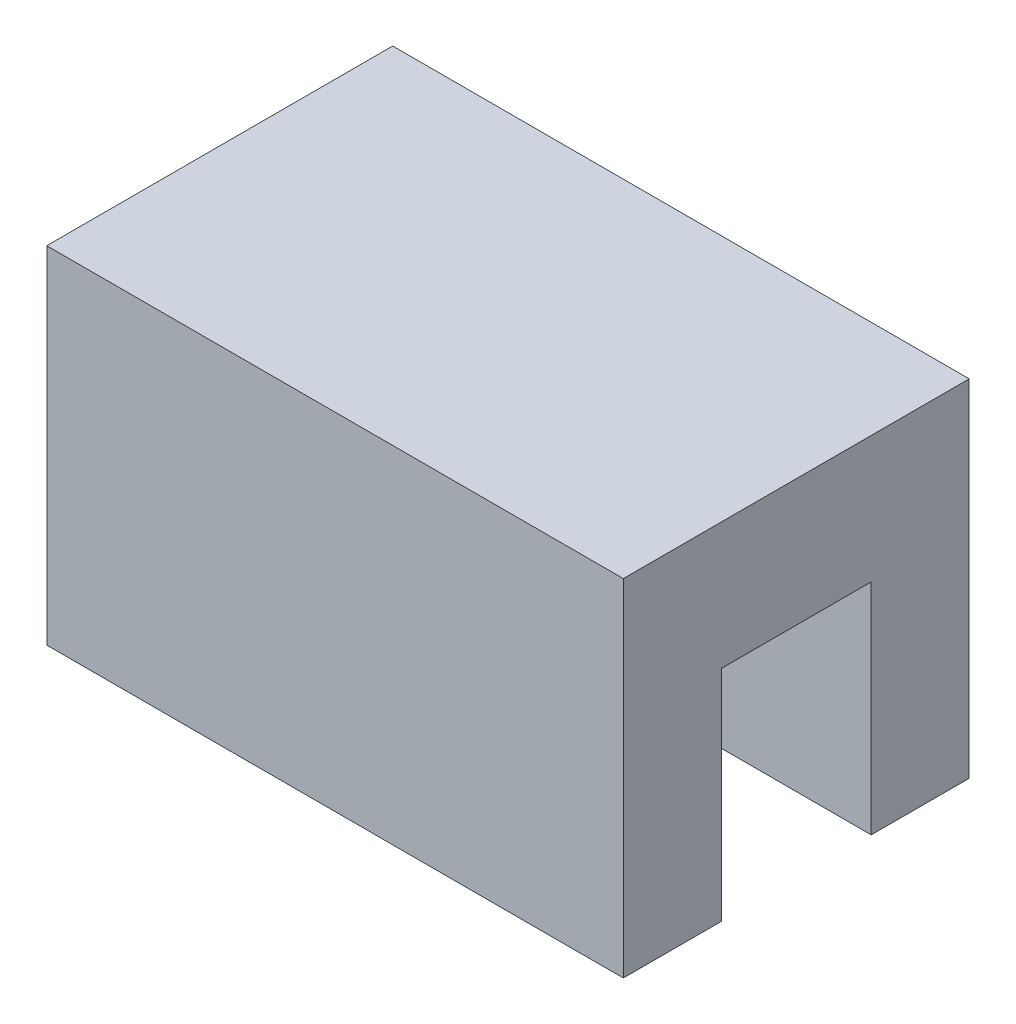
ISO-10303-21;
HEADER;
FILE_DESCRIPTION(('STEP AP214'),'2;1');
FILE_NAME('part.step','',(''),(''),'','','');
FILE_SCHEMA(('AUTOMOTIVE_DESIGN { 1 0 10303 214 1 1 1 1 }'));
ENDSEC;
DATA;
#1=APPLICATION_CONTEXT('core data for automotive mechanical design processes');
#2=APPLICATION_PROTOCOL_DEFINITION('international standard','automotive_design',2000,#1);
#3=PRODUCT_CONTEXT('',#1,'mechanical');
#4=PRODUCT('Part','Part','',(#3));
#5=PRODUCT_RELATED_PRODUCT_CATEGORY('part','',(#4));
#6=PRODUCT_DEFINITION_FORMATION('','',#4);
#7=PRODUCT_DEFINITION_CONTEXT('part definition',#1,'design');
#8=PRODUCT_DEFINITION('design','',#6,#7);
#9=PRODUCT_DEFINITION_SHAPE('','',#8);
#10=(LENGTH_UNIT() NAMED_UNIT(*) SI_UNIT(.MILLI.,.METRE.));
#11=(NAMED_UNIT(*) PLANE_ANGLE_UNIT() SI_UNIT($,.RADIAN.));
#12=(NAMED_UNIT(*) SI_UNIT($,.STERADIAN.) SOLID_ANGLE_UNIT());
#13=UNCERTAINTY_MEASURE_WITH_UNIT(LENGTH_MEASURE(1.E-05),#10,'distance_accuracy_value','');
#14=(GEOMETRIC_REPRESENTATION_CONTEXT(3) GLOBAL_UNCERTAINTY_ASSIGNED_CONTEXT((#13)) GLOBAL_UNIT_ASSIGNED_CONTEXT((#10,
#11,#12)) REPRESENTATION_CONTEXT('',''));
#15=CARTESIAN_POINT('',(0.,0.,0.));
#16=DIRECTION('',(0.,0.,1.));
#17=DIRECTION('',(1.,0.,0.));
#18=AXIS2_PLACEMENT_3D('',#15,#16,#17);
#19=CARTESIAN_POINT('',(50.,0.,0.));
#20=DIRECTION('',(0.,0.,-1.));
#21=DIRECTION('',(-1.,0.,0.));
#22=AXIS2_PLACEMENT_3D('',#19,#20,#21);
#23=PLANE('',#22);
#24=DIRECTION('',(0.,-1.,0.));
#25=VECTOR('',#24,1.);
#26=CARTESIAN_POINT('',(0.,0.,0.));
#27=LINE('',#26,#25);
#28=CARTESIAN_POINT('',(0.,30.,0.));
#29=VERTEX_POINT('',#28);
#30=CARTESIAN_POINT('',(0.,0.,0.));
#31=VERTEX_POINT('',#30);
#32=EDGE_CURVE('E139',#29,#31,#27,.T.);
#33=ORIENTED_EDGE('',*,*,#32,.T.);
#34=DIRECTION('',(-1.,0.,0.));
#35=VECTOR('',#34,1.);
#36=CARTESIAN_POINT('',(50.,0.,0.));
#37=LINE('',#36,#35);
#38=CARTESIAN_POINT('',(50.,0.,0.));
#39=VERTEX_POINT('',#38);
#40=EDGE_CURVE('E11',#39,#31,#37,.T.);
#41=ORIENTED_EDGE('',*,*,#40,.F.);
#42=DIRECTION('',(0.,-1.,0.));
#43=VECTOR('',#42,1.);
#44=CARTESIAN_POINT('',(50.,0.,0.));
#45=LINE('',#44,#43);
#46=CARTESIAN_POINT('',(50.,30.,0.));
#47=VERTEX_POINT('',#46);
#48=EDGE_CURVE('E143',#47,#39,#45,.T.);
#49=ORIENTED_EDGE('',*,*,#48,.F.);
#50=DIRECTION('',(-1.,0.,0.));
#51=VECTOR('',#50,1.);
#52=CARTESIAN_POINT('',(50.,30.,0.));
#53=LINE('',#52,#51);
#54=EDGE_CURVE('E150',#47,#29,#53,.T.);
#55=ORIENTED_EDGE('',*,*,#54,.T.);
#56=EDGE_LOOP('',(#33,#41,#49,#55));
#57=FACE_BOUND('',#56,.T.);
#58=ADVANCED_FACE('F33',(#57),#23,.F.);
#59=CARTESIAN_POINT('',(50.,0.,0.));
#60=DIRECTION('',(0.,1.,0.));
#61=DIRECTION('',(0.,0.,1.));
#62=AXIS2_PLACEMENT_3D('',#59,#60,#61);
#63=PLANE('',#62);
#64=DIRECTION('',(0.,0.,-1.));
#65=VECTOR('',#64,1.);
#66=CARTESIAN_POINT('',(32.,0.,-8.5));
#67=LINE('',#66,#65);
#68=CARTESIAN_POINT('',(32.,0.,-8.5));
#69=VERTEX_POINT('',#68);
#70=CARTESIAN_POINT('',(32.,0.,-21.5));
#71=VERTEX_POINT('',#70);
#72=EDGE_CURVE('E121',#69,#71,#67,.T.);
#73=ORIENTED_EDGE('',*,*,#72,.F.);
#74=DIRECTION('',(1.,0.,0.));
#75=VECTOR('',#74,1.);
#76=CARTESIAN_POINT('',(32.,0.,-8.5));
#77=LINE('',#76,#75);
#78=CARTESIAN_POINT('',(50.,0.,-8.5));
#79=VERTEX_POINT('',#78);
#80=EDGE_CURVE('E107',#69,#79,#77,.T.);
#81=ORIENTED_EDGE('',*,*,#80,.T.);
#82=DIRECTION('',(0.,0.,-1.));
#83=VECTOR('',#82,1.);
#84=CARTESIAN_POINT('',(50.,0.,0.));
#85=LINE('',#84,#83);
#86=EDGE_CURVE('E84',#39,#79,#85,.T.);
#87=ORIENTED_EDGE('',*,*,#86,.F.);
#88=ORIENTED_EDGE('',*,*,#40,.T.);
#89=DIRECTION('',(0.,0.,-1.));
#90=VECTOR('',#89,1.);
#91=CARTESIAN_POINT('',(0.,0.,0.));
#92=LINE('',#91,#90);
#93=CARTESIAN_POINT('',(0.,0.,-30.));
#94=VERTEX_POINT('',#93);
#95=EDGE_CURVE('E153',#31,#94,#92,.T.);
#96=ORIENTED_EDGE('',*,*,#95,.T.);
#97=DIRECTION('',(-1.,0.,0.));
#98=VECTOR('',#97,1.);
#99=CARTESIAN_POINT('',(50.,0.,-30.));
#100=LINE('',#99,#98);
#101=CARTESIAN_POINT('',(50.,0.,-30.));
#102=VERTEX_POINT('',#101);
#103=EDGE_CURVE('E40',#102,#94,#100,.T.);
#104=ORIENTED_EDGE('',*,*,#103,.F.);
#105=CARTESIAN_POINT('',(50.,0.,-21.5));
#106=VERTEX_POINT('',#105);
#107=EDGE_CURVE('E145',#106,#102,#85,.T.);
#108=ORIENTED_EDGE('',*,*,#107,.F.);
#109=DIRECTION('',(1.,0.,0.));
#110=VECTOR('',#109,1.);
#111=CARTESIAN_POINT('',(32.,0.,-21.5));
#112=LINE('',#111,#110);
#113=EDGE_CURVE('E47',#71,#106,#112,.T.);
#114=ORIENTED_EDGE('',*,*,#113,.F.);
#115=EDGE_LOOP('',(#73,#81,#87,#88,#96,#104,#108,#114));
#116=FACE_BOUND('',#115,.T.);
#117=ADVANCED_FACE('F125',(#116),#63,.F.);
#118=CARTESIAN_POINT('',(50.,0.,-30.));
#119=DIRECTION('',(0.,0.,1.));
#120=DIRECTION('',(1.,0.,0.));
#121=AXIS2_PLACEMENT_3D('',#118,#119,#120);
#122=PLANE('',#121);
#123=DIRECTION('',(0.,1.,0.));
#124=VECTOR('',#123,1.);
#125=CARTESIAN_POINT('',(0.,0.,-30.));
#126=LINE('',#125,#124);
#127=CARTESIAN_POINT('',(0.,30.,-30.));
#128=VERTEX_POINT('',#127);
#129=EDGE_CURVE('E155',#94,#128,#126,.T.);
#130=ORIENTED_EDGE('',*,*,#129,.T.);
#131=DIRECTION('',(-1.,0.,0.));
#132=VECTOR('',#131,1.);
#133=CARTESIAN_POINT('',(50.,30.,-30.));
#134=LINE('',#133,#132);
#135=CARTESIAN_POINT('',(50.,30.,-30.));
#136=VERTEX_POINT('',#135);
#137=EDGE_CURVE('E159',#136,#128,#134,.T.);
#138=ORIENTED_EDGE('',*,*,#137,.F.);
#139=DIRECTION('',(0.,1.,0.));
#140=VECTOR('',#139,1.);
#141=CARTESIAN_POINT('',(50.,0.,-30.));
#142=LINE('',#141,#140);
#143=EDGE_CURVE('E147',#102,#136,#142,.T.);
#144=ORIENTED_EDGE('',*,*,#143,.F.);
#145=ORIENTED_EDGE('',*,*,#103,.T.);
#146=EDGE_LOOP('',(#130,#138,#144,#145));
#147=FACE_BOUND('',#146,.T.);
#148=ADVANCED_FACE('F165',(#147),#122,.F.);
#149=CARTESIAN_POINT('',(50.,30.,0.));
#150=DIRECTION('',(0.,-1.,0.));
#151=DIRECTION('',(0.,0.,-1.));
#152=AXIS2_PLACEMENT_3D('',#149,#150,#151);
#153=PLANE('',#152);
#154=DIRECTION('',(0.,0.,1.));
#155=VECTOR('',#154,1.);
#156=CARTESIAN_POINT('',(0.,30.,0.));
#157=LINE('',#156,#155);
#158=EDGE_CURVE('E77',#128,#29,#157,.T.);
#159=ORIENTED_EDGE('',*,*,#158,.T.);
#160=ORIENTED_EDGE('',*,*,#54,.F.);
#161=DIRECTION('',(0.,0.,1.));
#162=VECTOR('',#161,1.);
#163=CARTESIAN_POINT('',(50.,30.,0.));
#164=LINE('',#163,#162);
#165=EDGE_CURVE('E56',#136,#47,#164,.T.);
#166=ORIENTED_EDGE('',*,*,#165,.F.);
#167=ORIENTED_EDGE('',*,*,#137,.T.);
#168=EDGE_LOOP('',(#159,#160,#166,#167));
#169=FACE_BOUND('',#168,.T.);
#170=ADVANCED_FACE('F173',(#169),#153,.F.);
#171=CARTESIAN_POINT('',(50.,0.,0.));
#172=DIRECTION('',(-1.,0.,0.));
#173=DIRECTION('',(0.,0.,1.));
#174=AXIS2_PLACEMENT_3D('',#171,#172,#173);
#175=PLANE('',#174);
#176=ORIENTED_EDGE('',*,*,#86,.T.);
#177=DIRECTION('',(0.,-1.,0.));
#178=VECTOR('',#177,1.);
#179=CARTESIAN_POINT('',(50.,19.,-8.5));
#180=LINE('',#179,#178);
#181=CARTESIAN_POINT('',(50.,19.,-8.5));
#182=VERTEX_POINT('',#181);
#183=EDGE_CURVE('E113',#182,#79,#180,.T.);
#184=ORIENTED_EDGE('',*,*,#183,.F.);
#185=DIRECTION('',(0.,0.,1.));
#186=VECTOR('',#185,1.);
#187=CARTESIAN_POINT('',(50.,19.,-8.5));
#188=LINE('',#187,#186);
#189=CARTESIAN_POINT('',(50.,19.,-21.5));
#190=VERTEX_POINT('',#189);
#191=EDGE_CURVE('E123',#190,#182,#188,.T.);
#192=ORIENTED_EDGE('',*,*,#191,.F.);
#193=DIRECTION('',(0.,1.,0.));
#194=VECTOR('',#193,1.);
#195=CARTESIAN_POINT('',(50.,19.,-21.5));
#196=LINE('',#195,#194);
#197=EDGE_CURVE('E133',#106,#190,#196,.T.);
#198=ORIENTED_EDGE('',*,*,#197,.F.);
#199=ORIENTED_EDGE('',*,*,#107,.T.);
#200=ORIENTED_EDGE('',*,*,#143,.T.);
#201=ORIENTED_EDGE('',*,*,#165,.T.);
#202=ORIENTED_EDGE('',*,*,#48,.T.);
#203=EDGE_LOOP('',(#176,#184,#192,#198,#199,#200,#201,#202));
#204=FACE_BOUND('',#203,.T.);
#205=ADVANCED_FACE('F175',(#204),#175,.F.);
#206=CARTESIAN_POINT('',(0.,0.,0.));
#207=DIRECTION('',(-1.,0.,0.));
#208=DIRECTION('',(0.,0.,1.));
#209=AXIS2_PLACEMENT_3D('',#206,#207,#208);
#210=PLANE('',#209);
#211=ORIENTED_EDGE('',*,*,#32,.F.);
#212=ORIENTED_EDGE('',*,*,#158,.F.);
#213=ORIENTED_EDGE('',*,*,#129,.F.);
#214=ORIENTED_EDGE('',*,*,#95,.F.);
#215=EDGE_LOOP('',(#211,#212,#213,#214));
#216=FACE_BOUND('',#215,.T.);
#217=ADVANCED_FACE('F169',(#216),#210,.T.);
#218=CARTESIAN_POINT('',(32.,19.,-8.5));
#219=DIRECTION('',(0.,0.,1.));
#220=DIRECTION('',(1.,0.,0.));
#221=AXIS2_PLACEMENT_3D('',#218,#219,#220);
#222=PLANE('',#221);
#223=ORIENTED_EDGE('',*,*,#183,.T.);
#224=ORIENTED_EDGE('',*,*,#80,.F.);
#225=DIRECTION('',(0.,-1.,0.));
#226=VECTOR('',#225,1.);
#227=CARTESIAN_POINT('',(32.,19.,-8.5));
#228=LINE('',#227,#226);
#229=CARTESIAN_POINT('',(32.,19.,-8.5));
#230=VERTEX_POINT('',#229);
#231=EDGE_CURVE('E110',#230,#69,#228,.T.);
#232=ORIENTED_EDGE('',*,*,#231,.F.);
#233=DIRECTION('',(1.,0.,0.));
#234=VECTOR('',#233,1.);
#235=CARTESIAN_POINT('',(32.,19.,-8.5));
#236=LINE('',#235,#234);
#237=EDGE_CURVE('E137',#230,#182,#236,.T.);
#238=ORIENTED_EDGE('',*,*,#237,.T.);
#239=EDGE_LOOP('',(#223,#224,#232,#238));
#240=FACE_BOUND('',#239,.T.);
#241=ADVANCED_FACE('F109',(#240),#222,.F.);
#242=CARTESIAN_POINT('',(32.,19.,-8.5));
#243=DIRECTION('',(0.,1.,0.));
#244=DIRECTION('',(0.,0.,1.));
#245=AXIS2_PLACEMENT_3D('',#242,#243,#244);
#246=PLANE('',#245);
#247=ORIENTED_EDGE('',*,*,#191,.T.);
#248=ORIENTED_EDGE('',*,*,#237,.F.);
#249=DIRECTION('',(0.,0.,1.));
#250=VECTOR('',#249,1.);
#251=CARTESIAN_POINT('',(32.,19.,-8.5));
#252=LINE('',#251,#250);
#253=CARTESIAN_POINT('',(32.,19.,-21.5));
#254=VERTEX_POINT('',#253);
#255=EDGE_CURVE('E115',#254,#230,#252,.T.);
#256=ORIENTED_EDGE('',*,*,#255,.F.);
#257=DIRECTION('',(1.,0.,0.));
#258=VECTOR('',#257,1.);
#259=CARTESIAN_POINT('',(32.,19.,-21.5));
#260=LINE('',#259,#258);
#261=EDGE_CURVE('E140',#254,#190,#260,.T.);
#262=ORIENTED_EDGE('',*,*,#261,.T.);
#263=EDGE_LOOP('',(#247,#248,#256,#262));
#264=FACE_BOUND('',#263,.T.);
#265=ADVANCED_FACE('F219',(#264),#246,.F.);
#266=CARTESIAN_POINT('',(32.,19.,-21.5));
#267=DIRECTION('',(0.,0.,-1.));
#268=DIRECTION('',(0.,1.,0.));
#269=AXIS2_PLACEMENT_3D('',#266,#267,#268);
#270=PLANE('',#269);
#271=ORIENTED_EDGE('',*,*,#197,.T.);
#272=ORIENTED_EDGE('',*,*,#261,.F.);
#273=DIRECTION('',(0.,1.,0.));
#274=VECTOR('',#273,1.);
#275=CARTESIAN_POINT('',(32.,19.,-21.5));
#276=LINE('',#275,#274);
#277=EDGE_CURVE('E127',#71,#254,#276,.T.);
#278=ORIENTED_EDGE('',*,*,#277,.F.);
#279=ORIENTED_EDGE('',*,*,#113,.T.);
#280=EDGE_LOOP('',(#271,#272,#278,#279));
#281=FACE_BOUND('',#280,.T.);
#282=ADVANCED_FACE('F225',(#281),#270,.F.);
#283=CARTESIAN_POINT('',(32.,0.,0.));
#284=DIRECTION('',(1.,0.,0.));
#285=DIRECTION('',(0.,0.,-1.));
#286=AXIS2_PLACEMENT_3D('',#283,#284,#285);
#287=PLANE('',#286);
#288=ORIENTED_EDGE('',*,*,#231,.T.);
#289=ORIENTED_EDGE('',*,*,#72,.T.);
#290=ORIENTED_EDGE('',*,*,#277,.T.);
#291=ORIENTED_EDGE('',*,*,#255,.T.);
#292=EDGE_LOOP('',(#288,#289,#290,#291));
#293=FACE_BOUND('',#292,.T.);
#294=ADVANCED_FACE('F119',(#293),#287,.T.);
#295=CLOSED_SHELL('',(#58,#117,#148,#170,#205,#217,#241,#265,#282,#294));
#296=MANIFOLD_SOLID_BREP('B2',#295);
#297=ADVANCED_BREP_SHAPE_REPRESENTATION('',(#18,#296),#14);
#298=SHAPE_DEFINITION_REPRESENTATION(#9,#297);
ENDSEC;
END-ISO-10303-21;
